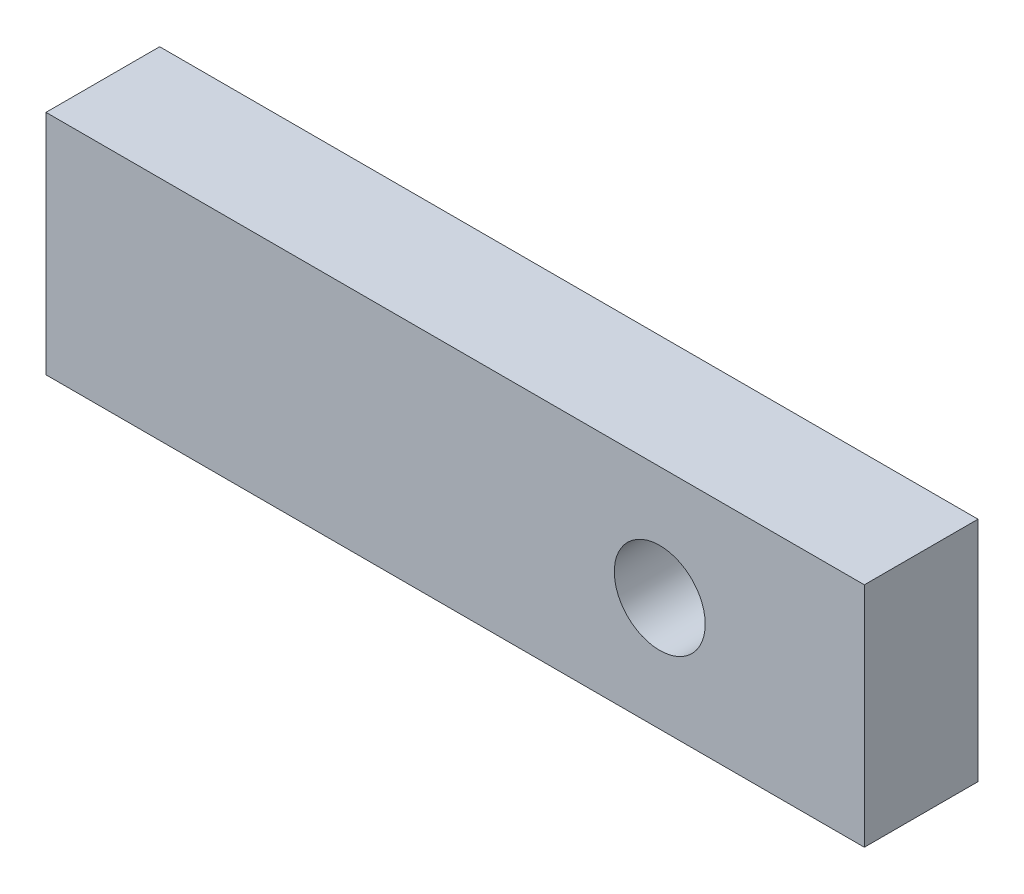
ISO-10303-21;
HEADER;
FILE_DESCRIPTION(('STEP AP214'),'2;1');
FILE_NAME('part.step','',(''),(''),'','','');
FILE_SCHEMA(('AUTOMOTIVE_DESIGN { 1 0 10303 214 1 1 1 1 }'));
ENDSEC;
DATA;
#1=APPLICATION_CONTEXT('core data for automotive mechanical design processes');
#2=APPLICATION_PROTOCOL_DEFINITION('international standard','automotive_design',2000,#1);
#3=PRODUCT_CONTEXT('',#1,'mechanical');
#4=PRODUCT('Part','Part','',(#3));
#5=PRODUCT_RELATED_PRODUCT_CATEGORY('part','',(#4));
#6=PRODUCT_DEFINITION_FORMATION('','',#4);
#7=PRODUCT_DEFINITION_CONTEXT('part definition',#1,'design');
#8=PRODUCT_DEFINITION('design','',#6,#7);
#9=PRODUCT_DEFINITION_SHAPE('','',#8);
#10=(LENGTH_UNIT() NAMED_UNIT(*) SI_UNIT(.MILLI.,.METRE.));
#11=(NAMED_UNIT(*) PLANE_ANGLE_UNIT() SI_UNIT($,.RADIAN.));
#12=(NAMED_UNIT(*) SI_UNIT($,.STERADIAN.) SOLID_ANGLE_UNIT());
#13=UNCERTAINTY_MEASURE_WITH_UNIT(LENGTH_MEASURE(1.E-05),#10,'distance_accuracy_value','');
#14=(GEOMETRIC_REPRESENTATION_CONTEXT(3) GLOBAL_UNCERTAINTY_ASSIGNED_CONTEXT((#13)) GLOBAL_UNIT_ASSIGNED_CONTEXT((#10,
#11,#12)) REPRESENTATION_CONTEXT('',''));
#15=CARTESIAN_POINT('',(0.,0.,0.));
#16=DIRECTION('',(0.,0.,1.));
#17=DIRECTION('',(1.,0.,0.));
#18=AXIS2_PLACEMENT_3D('',#15,#16,#17);
#19=CARTESIAN_POINT('',(9.,5.,0.));
#20=DIRECTION('',(-1.,0.,0.));
#21=DIRECTION('',(0.,0.,1.));
#22=AXIS2_PLACEMENT_3D('',#19,#20,#21);
#23=PLANE('',#22);
#24=DIRECTION('',(0.,0.,-1.));
#25=VECTOR('',#24,1.);
#26=CARTESIAN_POINT('',(9.,0.,0.));
#27=LINE('',#26,#25);
#28=CARTESIAN_POINT('',(9.,0.,0.));
#29=VERTEX_POINT('',#28);
#30=CARTESIAN_POINT('',(9.,0.,-2.5));
#31=VERTEX_POINT('',#30);
#32=EDGE_CURVE('E100',#29,#31,#27,.T.);
#33=ORIENTED_EDGE('',*,*,#32,.T.);
#34=DIRECTION('',(0.,-1.,0.));
#35=VECTOR('',#34,1.);
#36=CARTESIAN_POINT('',(9.,5.,-2.5));
#37=LINE('',#36,#35);
#38=CARTESIAN_POINT('',(9.,5.,-2.5));
#39=VERTEX_POINT('',#38);
#40=EDGE_CURVE('E11',#39,#31,#37,.T.);
#41=ORIENTED_EDGE('',*,*,#40,.F.);
#42=DIRECTION('',(0.,0.,-1.));
#43=VECTOR('',#42,1.);
#44=CARTESIAN_POINT('',(9.,5.,0.));
#45=LINE('',#44,#43);
#46=CARTESIAN_POINT('',(9.,5.,0.));
#47=VERTEX_POINT('',#46);
#48=EDGE_CURVE('E88',#47,#39,#45,.T.);
#49=ORIENTED_EDGE('',*,*,#48,.F.);
#50=DIRECTION('',(0.,-1.,0.));
#51=VECTOR('',#50,1.);
#52=CARTESIAN_POINT('',(9.,5.,0.));
#53=LINE('',#52,#51);
#54=EDGE_CURVE('E96',#47,#29,#53,.T.);
#55=ORIENTED_EDGE('',*,*,#54,.T.);
#56=EDGE_LOOP('',(#33,#41,#49,#55));
#57=FACE_BOUND('',#56,.T.);
#58=ADVANCED_FACE('F37',(#57),#23,.F.);
#59=CARTESIAN_POINT('',(-9.,5.,-2.5));
#60=DIRECTION('',(0.,0.,1.));
#61=DIRECTION('',(1.,0.,0.));
#62=AXIS2_PLACEMENT_3D('',#59,#60,#61);
#63=PLANE('',#62);
#64=CARTESIAN_POINT('',(4.5,2.5,-2.5));
#65=DIRECTION('',(0.,0.,1.));
#66=DIRECTION('',(1.,0.,0.));
#67=AXIS2_PLACEMENT_3D('',#64,#65,#66);
#68=CIRCLE('',#67,0.999999999999999);
#69=CARTESIAN_POINT('',(5.5,2.5,-2.5));
#70=VERTEX_POINT('',#69);
#71=EDGE_CURVE('E103',#70,#70,#68,.F.);
#72=ORIENTED_EDGE('',*,*,#71,.F.);
#73=EDGE_LOOP('',(#72));
#74=FACE_BOUND('',#73,.T.);
#75=DIRECTION('',(-1.,0.,0.));
#76=VECTOR('',#75,1.);
#77=CARTESIAN_POINT('',(-9.,0.,-2.5));
#78=LINE('',#77,#76);
#79=CARTESIAN_POINT('',(-9.,0.,-2.5));
#80=VERTEX_POINT('',#79);
#81=EDGE_CURVE('E92',#31,#80,#78,.T.);
#82=ORIENTED_EDGE('',*,*,#81,.T.);
#83=DIRECTION('',(0.,-1.,0.));
#84=VECTOR('',#83,1.);
#85=CARTESIAN_POINT('',(-9.,5.,-2.5));
#86=LINE('',#85,#84);
#87=CARTESIAN_POINT('',(-9.,5.,-2.5));
#88=VERTEX_POINT('',#87);
#89=EDGE_CURVE('E45',#88,#80,#86,.T.);
#90=ORIENTED_EDGE('',*,*,#89,.F.);
#91=DIRECTION('',(-1.,0.,0.));
#92=VECTOR('',#91,1.);
#93=CARTESIAN_POINT('',(-9.,5.,-2.5));
#94=LINE('',#93,#92);
#95=EDGE_CURVE('E83',#39,#88,#94,.T.);
#96=ORIENTED_EDGE('',*,*,#95,.F.);
#97=ORIENTED_EDGE('',*,*,#40,.T.);
#98=EDGE_LOOP('',(#82,#90,#96,#97));
#99=FACE_BOUND('',#98,.T.);
#100=ADVANCED_FACE('F91',(#74,#99),#63,.F.);
#101=CARTESIAN_POINT('',(-9.,5.,0.));
#102=DIRECTION('',(1.,0.,0.));
#103=DIRECTION('',(0.,0.,-1.));
#104=AXIS2_PLACEMENT_3D('',#101,#102,#103);
#105=PLANE('',#104);
#106=DIRECTION('',(0.,0.,1.));
#107=VECTOR('',#106,1.);
#108=CARTESIAN_POINT('',(-9.,0.,0.));
#109=LINE('',#108,#107);
#110=CARTESIAN_POINT('',(-9.,0.,0.));
#111=VERTEX_POINT('',#110);
#112=EDGE_CURVE('E70',#80,#111,#109,.T.);
#113=ORIENTED_EDGE('',*,*,#112,.T.);
#114=DIRECTION('',(0.,-1.,0.));
#115=VECTOR('',#114,1.);
#116=CARTESIAN_POINT('',(-9.,5.,0.));
#117=LINE('',#116,#115);
#118=CARTESIAN_POINT('',(-9.,5.,0.));
#119=VERTEX_POINT('',#118);
#120=EDGE_CURVE('E93',#119,#111,#117,.T.);
#121=ORIENTED_EDGE('',*,*,#120,.F.);
#122=DIRECTION('',(0.,0.,1.));
#123=VECTOR('',#122,1.);
#124=CARTESIAN_POINT('',(-9.,5.,0.));
#125=LINE('',#124,#123);
#126=EDGE_CURVE('E86',#88,#119,#125,.T.);
#127=ORIENTED_EDGE('',*,*,#126,.F.);
#128=ORIENTED_EDGE('',*,*,#89,.T.);
#129=EDGE_LOOP('',(#113,#121,#127,#128));
#130=FACE_BOUND('',#129,.T.);
#131=ADVANCED_FACE('F94',(#130),#105,.F.);
#132=CARTESIAN_POINT('',(-9.,5.,0.));
#133=DIRECTION('',(0.,0.,-1.));
#134=DIRECTION('',(-1.,0.,0.));
#135=AXIS2_PLACEMENT_3D('',#132,#133,#134);
#136=PLANE('',#135);
#137=CARTESIAN_POINT('',(4.5,2.5,0.));
#138=DIRECTION('',(0.,0.,1.));
#139=DIRECTION('',(1.,0.,0.));
#140=AXIS2_PLACEMENT_3D('',#137,#138,#139);
#141=CIRCLE('',#140,0.999999999999999);
#142=CARTESIAN_POINT('',(5.5,2.5,0.));
#143=VERTEX_POINT('',#142);
#144=EDGE_CURVE('E116',#143,#143,#141,.T.);
#145=ORIENTED_EDGE('',*,*,#144,.F.);
#146=EDGE_LOOP('',(#145));
#147=FACE_BOUND('',#146,.T.);
#148=DIRECTION('',(1.,0.,0.));
#149=VECTOR('',#148,1.);
#150=CARTESIAN_POINT('',(-9.,0.,0.));
#151=LINE('',#150,#149);
#152=EDGE_CURVE('E76',#111,#29,#151,.T.);
#153=ORIENTED_EDGE('',*,*,#152,.T.);
#154=ORIENTED_EDGE('',*,*,#54,.F.);
#155=DIRECTION('',(1.,0.,0.));
#156=VECTOR('',#155,1.);
#157=CARTESIAN_POINT('',(-9.,5.,0.));
#158=LINE('',#157,#156);
#159=EDGE_CURVE('E53',#119,#47,#158,.T.);
#160=ORIENTED_EDGE('',*,*,#159,.F.);
#161=ORIENTED_EDGE('',*,*,#120,.T.);
#162=EDGE_LOOP('',(#153,#154,#160,#161));
#163=FACE_BOUND('',#162,.T.);
#164=ADVANCED_FACE('F108',(#147,#163),#136,.F.);
#165=CARTESIAN_POINT('',(0.,5.,0.));
#166=DIRECTION('',(0.,-1.,0.));
#167=DIRECTION('',(0.,0.,-1.));
#168=AXIS2_PLACEMENT_3D('',#165,#166,#167);
#169=PLANE('',#168);
#170=ORIENTED_EDGE('',*,*,#48,.T.);
#171=ORIENTED_EDGE('',*,*,#95,.T.);
#172=ORIENTED_EDGE('',*,*,#126,.T.);
#173=ORIENTED_EDGE('',*,*,#159,.T.);
#174=EDGE_LOOP('',(#170,#171,#172,#173));
#175=FACE_BOUND('',#174,.T.);
#176=ADVANCED_FACE('F84',(#175),#169,.F.);
#177=CARTESIAN_POINT('',(0.,0.,0.));
#178=DIRECTION('',(0.,-1.,0.));
#179=DIRECTION('',(0.,0.,-1.));
#180=AXIS2_PLACEMENT_3D('',#177,#178,#179);
#181=PLANE('',#180);
#182=ORIENTED_EDGE('',*,*,#32,.F.);
#183=ORIENTED_EDGE('',*,*,#152,.F.);
#184=ORIENTED_EDGE('',*,*,#112,.F.);
#185=ORIENTED_EDGE('',*,*,#81,.F.);
#186=EDGE_LOOP('',(#182,#183,#184,#185));
#187=FACE_BOUND('',#186,.T.);
#188=ADVANCED_FACE('F111',(#187),#181,.T.);
#189=CARTESIAN_POINT('',(4.5,2.5,-5.32842712474619));
#190=DIRECTION('',(0.,0.,1.));
#191=DIRECTION('',(1.,0.,0.));
#192=AXIS2_PLACEMENT_3D('',#189,#190,#191);
#193=CYLINDRICAL_SURFACE('',#192,0.999999999999999);
#194=CARTESIAN_POINT('',(5.5,2.5,-2.5));
#195=CARTESIAN_POINT('',(5.5,2.5,-2.47395833333333));
#196=CARTESIAN_POINT('',(5.5,2.5,-2.44791666666667));
#197=CARTESIAN_POINT('',(5.5,2.5,-2.39583333333333));
#198=CARTESIAN_POINT('',(5.5,2.5,-2.36979166666667));
#199=CARTESIAN_POINT('',(5.5,2.5,-2.31770833333333));
#200=CARTESIAN_POINT('',(5.5,2.5,-2.29166666666667));
#201=CARTESIAN_POINT('',(5.5,2.5,-2.23958333333333));
#202=CARTESIAN_POINT('',(5.5,2.5,-2.21354166666667));
#203=CARTESIAN_POINT('',(5.5,2.5,-2.16145833333333));
#204=CARTESIAN_POINT('',(5.5,2.5,-2.13541666666667));
#205=CARTESIAN_POINT('',(5.5,2.5,-2.08333333333333));
#206=CARTESIAN_POINT('',(5.5,2.5,-2.05729166666667));
#207=CARTESIAN_POINT('',(5.5,2.5,-2.00520833333333));
#208=CARTESIAN_POINT('',(5.5,2.5,-1.97916666666667));
#209=CARTESIAN_POINT('',(5.5,2.5,-1.92708333333333));
#210=CARTESIAN_POINT('',(5.5,2.5,-1.90104166666667));
#211=CARTESIAN_POINT('',(5.5,2.5,-1.84895833333333));
#212=CARTESIAN_POINT('',(5.5,2.5,-1.82291666666667));
#213=CARTESIAN_POINT('',(5.5,2.5,-1.77083333333333));
#214=CARTESIAN_POINT('',(5.5,2.5,-1.74479166666667));
#215=CARTESIAN_POINT('',(5.5,2.5,-1.69270833333333));
#216=CARTESIAN_POINT('',(5.5,2.5,-1.66666666666667));
#217=CARTESIAN_POINT('',(5.5,2.5,-1.61458333333333));
#218=CARTESIAN_POINT('',(5.5,2.5,-1.58854166666667));
#219=CARTESIAN_POINT('',(5.5,2.5,-1.53645833333333));
#220=CARTESIAN_POINT('',(5.5,2.5,-1.51041666666667));
#221=CARTESIAN_POINT('',(5.5,2.5,-1.45833333333333));
#222=CARTESIAN_POINT('',(5.5,2.5,-1.43229166666667));
#223=CARTESIAN_POINT('',(5.5,2.5,-1.38020833333333));
#224=CARTESIAN_POINT('',(5.5,2.5,-1.35416666666667));
#225=CARTESIAN_POINT('',(5.5,2.5,-1.30208333333333));
#226=CARTESIAN_POINT('',(5.5,2.5,-1.27604166666667));
#227=CARTESIAN_POINT('',(5.5,2.5,-1.22395833333333));
#228=CARTESIAN_POINT('',(5.5,2.5,-1.19791666666667));
#229=CARTESIAN_POINT('',(5.5,2.5,-1.14583333333333));
#230=CARTESIAN_POINT('',(5.5,2.5,-1.11979166666667));
#231=CARTESIAN_POINT('',(5.5,2.5,-1.06770833333333));
#232=CARTESIAN_POINT('',(5.5,2.5,-1.04166666666667));
#233=CARTESIAN_POINT('',(5.5,2.5,-0.989583333333333));
#234=CARTESIAN_POINT('',(5.5,2.5,-0.963541666666667));
#235=CARTESIAN_POINT('',(5.5,2.5,-0.911458333333333));
#236=CARTESIAN_POINT('',(5.5,2.5,-0.885416666666667));
#237=CARTESIAN_POINT('',(5.5,2.5,-0.833333333333333));
#238=CARTESIAN_POINT('',(5.5,2.5,-0.807291666666667));
#239=CARTESIAN_POINT('',(5.5,2.5,-0.755208333333334));
#240=CARTESIAN_POINT('',(5.5,2.5,-0.729166666666667));
#241=CARTESIAN_POINT('',(5.5,2.5,-0.677083333333334));
#242=CARTESIAN_POINT('',(5.5,2.5,-0.651041666666667));
#243=CARTESIAN_POINT('',(5.5,2.5,-0.598958333333334));
#244=CARTESIAN_POINT('',(5.5,2.5,-0.572916666666667));
#245=CARTESIAN_POINT('',(5.5,2.5,-0.520833333333334));
#246=CARTESIAN_POINT('',(5.5,2.5,-0.494791666666667));
#247=CARTESIAN_POINT('',(5.5,2.5,-0.442708333333334));
#248=CARTESIAN_POINT('',(5.5,2.5,-0.416666666666668));
#249=CARTESIAN_POINT('',(5.5,2.5,-0.364583333333335));
#250=CARTESIAN_POINT('',(5.5,2.5,-0.338541666666668));
#251=CARTESIAN_POINT('',(5.5,2.5,-0.286458333333334));
#252=CARTESIAN_POINT('',(5.5,2.5,-0.260416666666668));
#253=CARTESIAN_POINT('',(5.5,2.5,-0.208333333333334));
#254=CARTESIAN_POINT('',(5.5,2.5,-0.182291666666668));
#255=CARTESIAN_POINT('',(5.5,2.5,-0.130208333333334));
#256=CARTESIAN_POINT('',(5.5,2.5,-0.104166666666668));
#257=CARTESIAN_POINT('',(5.5,2.5,-0.0520833333333343));
#258=CARTESIAN_POINT('',(5.5,2.5,-0.0260416666666676));
#259=CARTESIAN_POINT('',(5.5,2.5,0.));
#260=B_SPLINE_CURVE_WITH_KNOTS('',3,(#194,#195,#196,#197,#198,#199,#200,#201,#202,#203,#204,
#205,#206,#207,#208,#209,#210,#211,#212,#213,#214,#215,#216,#217,#218,#219,#220,#221,#222,#223,
#224,#225,#226,#227,#228,#229,#230,#231,#232,#233,#234,#235,#236,#237,#238,#239,#240,#241,#242,
#243,#244,#245,#246,#247,#248,#249,#250,#251,#252,#253,#254,#255,#256,#257,#258,#259),
.UNSPECIFIED.,.F.,.F.,(4,2,2,2,2,2,2,2,2,2,2,2,2,2,2,2,2,2,2,2,2,2,2,2,2,2,2,2,2,2,2,2,4),(0.,
0.0781250000000001,0.15625,0.234375,0.3125,0.390625,0.46875,0.546875,0.625,0.703125,0.78125,
0.859374999999999,0.9375,1.015625,1.09375,1.171875,1.25,1.328125,1.40625,1.484375,1.5625,
1.640625,1.71875,1.796875,1.875,1.953125,2.03125,2.109375,2.1875,2.265625,2.34375,2.421875,2.5),.UNSPECIFIED.);
#261=EDGE_CURVE('BSEAM120',#70,#143,#260,.T.);
#262=ORIENTED_EDGE('',*,*,#71,.T.);
#263=ORIENTED_EDGE('',*,*,#144,.T.);
#264=ORIENTED_EDGE('',*,*,#261,.T.);
#265=ORIENTED_EDGE('',*,*,#261,.F.);
#266=EDGE_LOOP('',(#262,#264,#263,#265));
#267=FACE_BOUND('',#266,.T.);
#268=ADVANCED_FACE('F120',(#267),#193,.F.);
#269=CLOSED_SHELL('',(#58,#100,#131,#164,#176,#188,#268));
#270=MANIFOLD_SOLID_BREP('B2',#269);
#271=ADVANCED_BREP_SHAPE_REPRESENTATION('',(#18,#270),#14);
#272=SHAPE_DEFINITION_REPRESENTATION(#9,#271);
ENDSEC;
END-ISO-10303-21;
